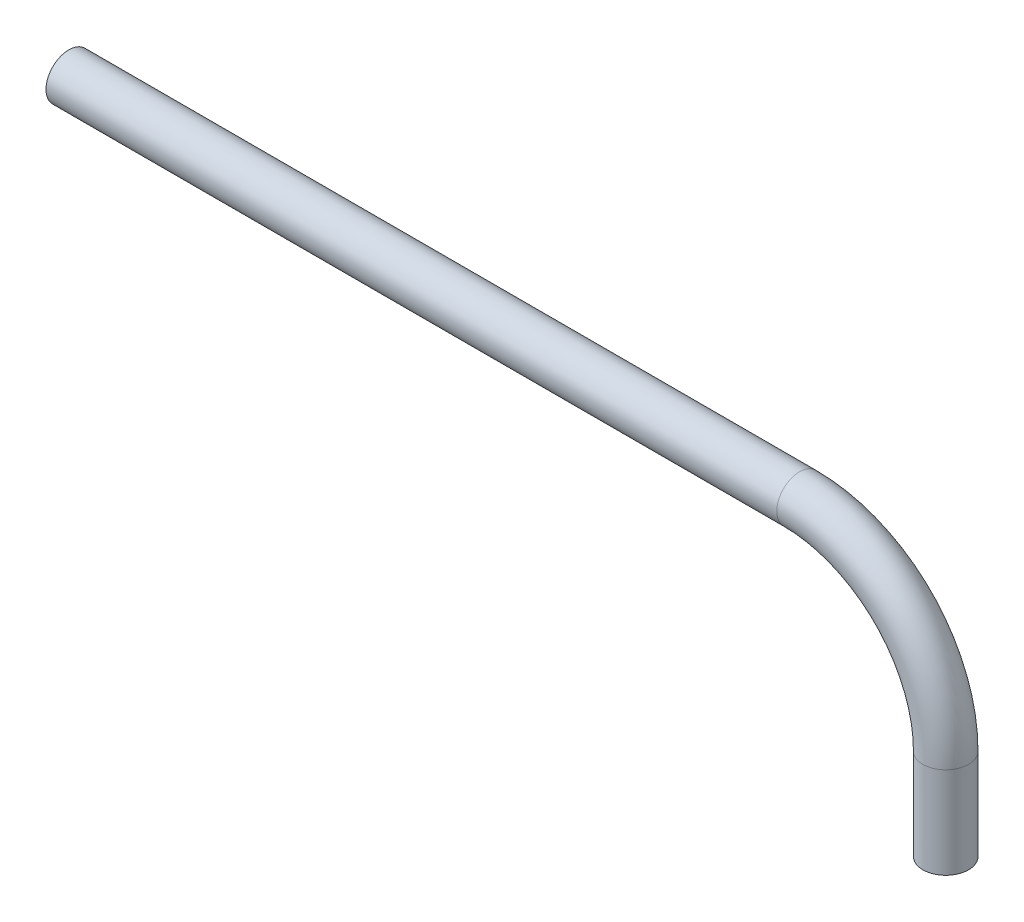
ISO-10303-21;
HEADER;
FILE_DESCRIPTION(('STEP AP214'),'2;1');
FILE_NAME('part.step','',(''),(''),'','','');
FILE_SCHEMA(('AUTOMOTIVE_DESIGN { 1 0 10303 214 1 1 1 1 }'));
ENDSEC;
DATA;
#1=APPLICATION_CONTEXT('core data for automotive mechanical design processes');
#2=APPLICATION_PROTOCOL_DEFINITION('international standard','automotive_design',2000,#1);
#3=PRODUCT_CONTEXT('',#1,'mechanical');
#4=PRODUCT('Part','Part','',(#3));
#5=PRODUCT_RELATED_PRODUCT_CATEGORY('part','',(#4));
#6=PRODUCT_DEFINITION_FORMATION('','',#4);
#7=PRODUCT_DEFINITION_CONTEXT('part definition',#1,'design');
#8=PRODUCT_DEFINITION('design','',#6,#7);
#9=PRODUCT_DEFINITION_SHAPE('','',#8);
#10=(LENGTH_UNIT() NAMED_UNIT(*) SI_UNIT(.MILLI.,.METRE.));
#11=(NAMED_UNIT(*) PLANE_ANGLE_UNIT() SI_UNIT($,.RADIAN.));
#12=(NAMED_UNIT(*) SI_UNIT($,.STERADIAN.) SOLID_ANGLE_UNIT());
#13=UNCERTAINTY_MEASURE_WITH_UNIT(LENGTH_MEASURE(1.E-05),#10,'distance_accuracy_value','');
#14=(GEOMETRIC_REPRESENTATION_CONTEXT(3) GLOBAL_UNCERTAINTY_ASSIGNED_CONTEXT((#13)) GLOBAL_UNIT_ASSIGNED_CONTEXT((#10,
#11,#12)) REPRESENTATION_CONTEXT('',''));
#15=CARTESIAN_POINT('',(0.,0.,0.));
#16=DIRECTION('',(0.,0.,1.));
#17=DIRECTION('',(1.,0.,0.));
#18=AXIS2_PLACEMENT_3D('',#15,#16,#17);
#19=CARTESIAN_POINT('',(0.,0.,0.));
#20=DIRECTION('',(-1.,0.,0.));
#21=DIRECTION('',(0.,0.,1.));
#22=AXIS2_PLACEMENT_3D('',#19,#20,#21);
#23=PLANE('',#22);
#24=CARTESIAN_POINT('',(0.,0.,0.));
#25=DIRECTION('',(-1.,0.,0.));
#26=DIRECTION('',(0.,0.,1.));
#27=AXIS2_PLACEMENT_3D('',#24,#25,#26);
#28=CIRCLE('',#27,2.5);
#29=CARTESIAN_POINT('',(0.,0.,2.5));
#30=VERTEX_POINT('',#29);
#31=EDGE_CURVE('E66',#30,#30,#28,.T.);
#32=ORIENTED_EDGE('',*,*,#31,.T.);
#33=EDGE_LOOP('',(#32));
#34=FACE_BOUND('',#33,.T.);
#35=ADVANCED_FACE('F49',(#34),#23,.T.);
#36=CARTESIAN_POINT('',(96.,-26.,0.));
#37=DIRECTION('',(0.,1.,0.));
#38=DIRECTION('',(0.,0.,1.));
#39=AXIS2_PLACEMENT_3D('',#36,#37,#38);
#40=PLANE('',#39);
#41=CARTESIAN_POINT('',(96.,-26.,0.));
#42=DIRECTION('',(0.,1.,0.));
#43=DIRECTION('',(0.,0.,1.));
#44=AXIS2_PLACEMENT_3D('',#41,#42,#43);
#45=CIRCLE('',#44,2.5);
#46=CARTESIAN_POINT('',(96.,-26.,2.5));
#47=VERTEX_POINT('',#46);
#48=EDGE_CURVE('E11',#47,#47,#45,.T.);
#49=ORIENTED_EDGE('',*,*,#48,.F.);
#50=EDGE_LOOP('',(#49));
#51=FACE_BOUND('',#50,.T.);
#52=ADVANCED_FACE('F77',(#51),#40,.F.);
#53=CARTESIAN_POINT('',(0.,0.,0.));
#54=DIRECTION('',(1.,0.,0.));
#55=DIRECTION('',(0.,0.,-1.));
#56=AXIS2_PLACEMENT_3D('',#53,#54,#55);
#57=CYLINDRICAL_SURFACE('',#56,2.5);
#58=CARTESIAN_POINT('',(80.,0.,0.));
#59=DIRECTION('',(-1.,0.,0.));
#60=DIRECTION('',(0.,0.,1.));
#61=AXIS2_PLACEMENT_3D('',#58,#59,#60);
#62=CIRCLE('',#61,2.5);
#63=CARTESIAN_POINT('',(80.,2.5,0.));
#64=VERTEX_POINT('',#63);
#65=EDGE_CURVE('E61',#64,#64,#62,.T.);
#66=ORIENTED_EDGE('',*,*,#65,.T.);
#67=EDGE_LOOP('',(#66));
#68=FACE_BOUND('',#67,.T.);
#69=ORIENTED_EDGE('',*,*,#31,.F.);
#70=EDGE_LOOP('',(#69));
#71=FACE_BOUND('',#70,.T.);
#72=ADVANCED_FACE('F74',(#68,#71),#57,.T.);
#73=CARTESIAN_POINT('',(80.,-16.,0.));
#74=DIRECTION('',(0.,0.,-1.));
#75=DIRECTION('',(-1.,0.,0.));
#76=AXIS2_PLACEMENT_3D('',#73,#74,#75);
#77=TOROIDAL_SURFACE('',#76,16.,2.5);
#78=CARTESIAN_POINT('',(96.0000000000001,-15.9999999999998,0.));
#79=DIRECTION('',(0.,1.,0.));
#80=DIRECTION('',(0.,0.,1.));
#81=AXIS2_PLACEMENT_3D('',#78,#79,#80);
#82=CIRCLE('',#81,2.5);
#83=CARTESIAN_POINT('',(98.5,-15.9999999999997,0.));
#84=VERTEX_POINT('',#83);
#85=EDGE_CURVE('E56',#84,#84,#82,.T.);
#86=CARTESIAN_POINT('',(80.,-16.,0.));
#87=DIRECTION('',(0.,0.,-1.));
#88=DIRECTION('',(-1.,0.,0.));
#89=AXIS2_PLACEMENT_3D('',#86,#87,#88);
#90=CIRCLE('',#89,18.5);
#91=EDGE_CURVE('',#64,#84,#90,.T.);
#92=ORIENTED_EDGE('',*,*,#65,.F.);
#93=ORIENTED_EDGE('',*,*,#85,.T.);
#94=ORIENTED_EDGE('',*,*,#91,.T.);
#95=ORIENTED_EDGE('',*,*,#91,.F.);
#96=EDGE_LOOP('',(#92,#94,#93,#95));
#97=FACE_BOUND('',#96,.T.);
#98=ADVANCED_FACE('F76',(#97),#77,.T.);
#99=CARTESIAN_POINT('',(96.,-16.,0.));
#100=DIRECTION('',(0.,-1.,0.));
#101=DIRECTION('',(1.,0.,0.));
#102=AXIS2_PLACEMENT_3D('',#99,#100,#101);
#103=CYLINDRICAL_SURFACE('',#102,2.5);
#104=ORIENTED_EDGE('',*,*,#48,.T.);
#105=EDGE_LOOP('',(#104));
#106=FACE_BOUND('',#105,.T.);
#107=ORIENTED_EDGE('',*,*,#85,.F.);
#108=EDGE_LOOP('',(#107));
#109=FACE_BOUND('',#108,.T.);
#110=ADVANCED_FACE('F84',(#106,#109),#103,.T.);
#111=CLOSED_SHELL('',(#35,#52,#72,#98,#110));
#112=MANIFOLD_SOLID_BREP('B2',#111);
#113=ADVANCED_BREP_SHAPE_REPRESENTATION('',(#18,#112),#14);
#114=SHAPE_DEFINITION_REPRESENTATION(#9,#113);
ENDSEC;
END-ISO-10303-21;
